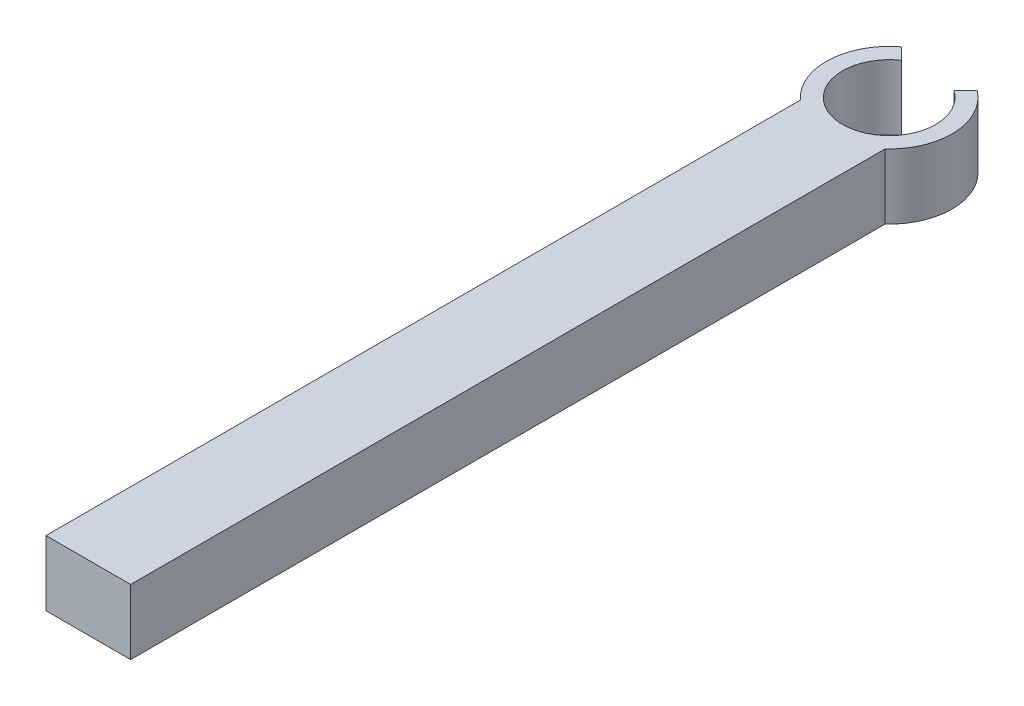
ISO-10303-21;
HEADER;
FILE_DESCRIPTION(('STEP AP214'),'2;1');
FILE_NAME('part.step','',(''),(''),'','','');
FILE_SCHEMA(('AUTOMOTIVE_DESIGN { 1 0 10303 214 1 1 1 1 }'));
ENDSEC;
DATA;
#1=APPLICATION_CONTEXT('core data for automotive mechanical design processes');
#2=APPLICATION_PROTOCOL_DEFINITION('international standard','automotive_design',2000,#1);
#3=PRODUCT_CONTEXT('',#1,'mechanical');
#4=PRODUCT('Part','Part','',(#3));
#5=PRODUCT_RELATED_PRODUCT_CATEGORY('part','',(#4));
#6=PRODUCT_DEFINITION_FORMATION('','',#4);
#7=PRODUCT_DEFINITION_CONTEXT('part definition',#1,'design');
#8=PRODUCT_DEFINITION('design','',#6,#7);
#9=PRODUCT_DEFINITION_SHAPE('','',#8);
#10=(LENGTH_UNIT() NAMED_UNIT(*) SI_UNIT(.MILLI.,.METRE.));
#11=(NAMED_UNIT(*) PLANE_ANGLE_UNIT() SI_UNIT($,.RADIAN.));
#12=(NAMED_UNIT(*) SI_UNIT($,.STERADIAN.) SOLID_ANGLE_UNIT());
#13=UNCERTAINTY_MEASURE_WITH_UNIT(LENGTH_MEASURE(1.E-05),#10,'distance_accuracy_value','');
#14=(GEOMETRIC_REPRESENTATION_CONTEXT(3) GLOBAL_UNCERTAINTY_ASSIGNED_CONTEXT((#13)) GLOBAL_UNIT_ASSIGNED_CONTEXT((#10,
#11,#12)) REPRESENTATION_CONTEXT('',''));
#15=CARTESIAN_POINT('',(0.,0.,0.));
#16=DIRECTION('',(0.,0.,1.));
#17=DIRECTION('',(1.,0.,0.));
#18=AXIS2_PLACEMENT_3D('',#15,#16,#17);
#19=CARTESIAN_POINT('',(-5.29648719383976,10.,-40.6315871682422));
#20=DIRECTION('',(0.,-1.,0.));
#21=DIRECTION('',(0.,0.,-1.));
#22=AXIS2_PLACEMENT_3D('',#19,#20,#21);
#23=CYLINDRICAL_SURFACE('',#22,9.65);
#24=CARTESIAN_POINT('',(-5.29648719383976,10.,-40.6315871682422));
#25=DIRECTION('',(0.,1.,0.));
#26=DIRECTION('',(0.,0.,1.));
#27=AXIS2_PLACEMENT_3D('',#24,#25,#26);
#28=CIRCLE('',#27,9.65);
#29=CARTESIAN_POINT('',(-11.0885304497728,10.,-48.3500543037168));
#30=VERTEX_POINT('',#29);
#31=CARTESIAN_POINT('',(-11.7964871938398,10.,-33.499091111461));
#32=VERTEX_POINT('',#31);
#33=EDGE_CURVE('E115',#30,#32,#28,.T.);
#34=ORIENTED_EDGE('',*,*,#33,.F.);
#35=DIRECTION('',(0.,-1.,0.));
#36=VECTOR('',#35,1.);
#37=CARTESIAN_POINT('',(-11.0885304497728,10.,-48.3500543037168));
#38=LINE('',#37,#36);
#39=CARTESIAN_POINT('',(-11.0885304497728,0.,-48.3500543037168));
#40=VERTEX_POINT('',#39);
#41=EDGE_CURVE('E144',#30,#40,#38,.T.);
#42=ORIENTED_EDGE('',*,*,#41,.T.);
#43=CARTESIAN_POINT('',(-5.29648719383976,0.,-40.6315871682422));
#44=DIRECTION('',(0.,1.,0.));
#45=DIRECTION('',(0.,0.,1.));
#46=AXIS2_PLACEMENT_3D('',#43,#44,#45);
#47=CIRCLE('',#46,9.65);
#48=CARTESIAN_POINT('',(-11.7964871938398,0.,-33.499091111461));
#49=VERTEX_POINT('',#48);
#50=EDGE_CURVE('E143',#40,#49,#47,.T.);
#51=ORIENTED_EDGE('',*,*,#50,.T.);
#52=DIRECTION('',(0.,-1.,0.));
#53=VECTOR('',#52,1.);
#54=CARTESIAN_POINT('',(-11.7964871938398,10.,-33.499091111461));
#55=LINE('',#54,#53);
#56=EDGE_CURVE('E41',#32,#49,#55,.T.);
#57=ORIENTED_EDGE('',*,*,#56,.F.);
#58=EDGE_LOOP('',(#34,#42,#51,#57));
#59=FACE_BOUND('',#58,.T.);
#60=ADVANCED_FACE('F33',(#59),#23,.T.);
#61=CARTESIAN_POINT('',(1.20351280616024,0.,-33.499091111461));
#62=VERTEX_POINT('',#61);
#63=CARTESIAN_POINT('',(0.495556062093275,0.,-48.3500543037168));
#64=VERTEX_POINT('',#63);
#65=EDGE_CURVE('E145',#62,#64,#47,.T.);
#66=ORIENTED_EDGE('',*,*,#65,.T.);
#67=DIRECTION('',(0.,-1.,0.));
#68=VECTOR('',#67,1.);
#69=CARTESIAN_POINT('',(0.495556062093279,10.,-48.3500543037168));
#70=LINE('',#69,#68);
#71=CARTESIAN_POINT('',(0.495556062093277,10.,-48.3500543037168));
#72=VERTEX_POINT('',#71);
#73=EDGE_CURVE('E55',#64,#72,#70,.F.);
#74=ORIENTED_EDGE('',*,*,#73,.T.);
#75=CARTESIAN_POINT('',(1.20351280616024,10.,-33.499091111461));
#76=VERTEX_POINT('',#75);
#77=EDGE_CURVE('E118',#76,#72,#28,.T.);
#78=ORIENTED_EDGE('',*,*,#77,.F.);
#79=DIRECTION('',(0.,-1.,0.));
#80=VECTOR('',#79,1.);
#81=CARTESIAN_POINT('',(1.20351280616024,10.,-33.499091111461));
#82=LINE('',#81,#80);
#83=EDGE_CURVE('E125',#76,#62,#82,.T.);
#84=ORIENTED_EDGE('',*,*,#83,.T.);
#85=EDGE_LOOP('',(#66,#74,#78,#84));
#86=FACE_BOUND('',#85,.T.);
#87=ADVANCED_FACE('F35',(#86),#23,.T.);
#88=CARTESIAN_POINT('',(-11.7964871938398,10.,0.));
#89=DIRECTION('',(1.,0.,0.));
#90=DIRECTION('',(0.,0.,-1.));
#91=AXIS2_PLACEMENT_3D('',#88,#89,#90);
#92=PLANE('',#91);
#93=DIRECTION('',(0.,0.,1.));
#94=VECTOR('',#93,1.);
#95=CARTESIAN_POINT('',(-11.7964871938398,0.,0.));
#96=LINE('',#95,#94);
#97=CARTESIAN_POINT('',(-11.7964871938397,0.,82.3470870334791));
#98=VERTEX_POINT('',#97);
#99=EDGE_CURVE('E138',#49,#98,#96,.T.);
#100=ORIENTED_EDGE('',*,*,#99,.T.);
#101=DIRECTION('',(0.,-1.,0.));
#102=VECTOR('',#101,1.);
#103=CARTESIAN_POINT('',(-11.7964871938397,10.,82.3470870334791));
#104=LINE('',#103,#102);
#105=CARTESIAN_POINT('',(-11.7964871938397,10.,82.3470870334791));
#106=VERTEX_POINT('',#105);
#107=EDGE_CURVE('E129',#106,#98,#104,.T.);
#108=ORIENTED_EDGE('',*,*,#107,.F.);
#109=DIRECTION('',(0.,0.,1.));
#110=VECTOR('',#109,1.);
#111=CARTESIAN_POINT('',(-11.7964871938398,10.,0.));
#112=LINE('',#111,#110);
#113=EDGE_CURVE('E139',#32,#106,#112,.T.);
#114=ORIENTED_EDGE('',*,*,#113,.F.);
#115=ORIENTED_EDGE('',*,*,#56,.T.);
#116=EDGE_LOOP('',(#100,#108,#114,#115));
#117=FACE_BOUND('',#116,.T.);
#118=ADVANCED_FACE('F135',(#117),#92,.F.);
#119=CARTESIAN_POINT('',(0.,10.,82.3470870334791));
#120=DIRECTION('',(0.,0.,-1.));
#121=DIRECTION('',(-1.,0.,0.));
#122=AXIS2_PLACEMENT_3D('',#119,#120,#121);
#123=PLANE('',#122);
#124=DIRECTION('',(1.,0.,0.));
#125=VECTOR('',#124,1.);
#126=CARTESIAN_POINT('',(0.,0.,82.3470870334791));
#127=LINE('',#126,#125);
#128=CARTESIAN_POINT('',(1.20351280616026,0.,82.3470870334791));
#129=VERTEX_POINT('',#128);
#130=EDGE_CURVE('E121',#98,#129,#127,.T.);
#131=ORIENTED_EDGE('',*,*,#130,.T.);
#132=DIRECTION('',(0.,-1.,0.));
#133=VECTOR('',#132,1.);
#134=CARTESIAN_POINT('',(1.20351280616026,10.,82.3470870334791));
#135=LINE('',#134,#133);
#136=CARTESIAN_POINT('',(1.20351280616026,10.,82.3470870334791));
#137=VERTEX_POINT('',#136);
#138=EDGE_CURVE('E127',#137,#129,#135,.T.);
#139=ORIENTED_EDGE('',*,*,#138,.F.);
#140=DIRECTION('',(1.,0.,0.));
#141=VECTOR('',#140,1.);
#142=CARTESIAN_POINT('',(0.,10.,82.3470870334791));
#143=LINE('',#142,#141);
#144=EDGE_CURVE('E155',#106,#137,#143,.T.);
#145=ORIENTED_EDGE('',*,*,#144,.F.);
#146=ORIENTED_EDGE('',*,*,#107,.T.);
#147=EDGE_LOOP('',(#131,#139,#145,#146));
#148=FACE_BOUND('',#147,.T.);
#149=ADVANCED_FACE('F177',(#148),#123,.F.);
#150=CARTESIAN_POINT('',(1.20351280616025,10.,0.));
#151=DIRECTION('',(1.,0.,0.));
#152=DIRECTION('',(0.,0.,-1.));
#153=AXIS2_PLACEMENT_3D('',#150,#151,#152);
#154=PLANE('',#153);
#155=DIRECTION('',(0.,0.,1.));
#156=VECTOR('',#155,1.);
#157=CARTESIAN_POINT('',(1.20351280616025,0.,0.));
#158=LINE('',#157,#156);
#159=EDGE_CURVE('E116',#62,#129,#158,.T.);
#160=ORIENTED_EDGE('',*,*,#159,.F.);
#161=ORIENTED_EDGE('',*,*,#83,.F.);
#162=DIRECTION('',(0.,0.,1.));
#163=VECTOR('',#162,1.);
#164=CARTESIAN_POINT('',(1.20351280616025,10.,0.));
#165=LINE('',#164,#163);
#166=EDGE_CURVE('E152',#76,#137,#165,.T.);
#167=ORIENTED_EDGE('',*,*,#166,.T.);
#168=ORIENTED_EDGE('',*,*,#138,.T.);
#169=EDGE_LOOP('',(#160,#161,#167,#168));
#170=FACE_BOUND('',#169,.T.);
#171=ADVANCED_FACE('F173',(#170),#154,.T.);
#172=CARTESIAN_POINT('',(-5.29648719383976,10.,-40.6315871682422));
#173=DIRECTION('',(0.,-1.,0.));
#174=DIRECTION('',(0.,0.,-1.));
#175=AXIS2_PLACEMENT_3D('',#172,#173,#174);
#176=CYLINDRICAL_SURFACE('',#175,7.15);
#177=DIRECTION('',(0.,1.,0.));
#178=VECTOR('',#177,1.);
#179=CARTESIAN_POINT('',(-9.29648719383976,0.,-46.5580110477838));
#180=LINE('',#179,#178);
#181=CARTESIAN_POINT('',(-9.29648719383975,0.,-46.5580110477838));
#182=VERTEX_POINT('',#181);
#183=CARTESIAN_POINT('',(-9.29648719383976,10.,-46.5580110477838));
#184=VERTEX_POINT('',#183);
#185=EDGE_CURVE('E48',#182,#184,#180,.T.);
#186=ORIENTED_EDGE('',*,*,#185,.T.);
#187=CARTESIAN_POINT('',(-5.29648719383976,10.,-40.6315871682422));
#188=DIRECTION('',(0.,1.,0.));
#189=DIRECTION('',(0.,0.,1.));
#190=AXIS2_PLACEMENT_3D('',#187,#188,#189);
#191=CIRCLE('',#190,7.15);
#192=CARTESIAN_POINT('',(-1.29648719383976,10.,-46.5580110477838));
#193=VERTEX_POINT('',#192);
#194=EDGE_CURVE('E111',#184,#193,#191,.T.);
#195=ORIENTED_EDGE('',*,*,#194,.T.);
#196=DIRECTION('',(0.,1.,0.));
#197=VECTOR('',#196,1.);
#198=CARTESIAN_POINT('',(-1.29648719383976,0.,-46.5580110477838));
#199=LINE('',#198,#197);
#200=CARTESIAN_POINT('',(-1.29648719383976,0.,-46.5580110477838));
#201=VERTEX_POINT('',#200);
#202=EDGE_CURVE('E97',#201,#193,#199,.T.);
#203=ORIENTED_EDGE('',*,*,#202,.F.);
#204=CARTESIAN_POINT('',(-5.29648719383976,0.,-40.6315871682422));
#205=DIRECTION('',(0.,1.,0.));
#206=DIRECTION('',(0.,0.,1.));
#207=AXIS2_PLACEMENT_3D('',#204,#205,#206);
#208=CIRCLE('',#207,7.15);
#209=EDGE_CURVE('E109',#182,#201,#208,.T.);
#210=ORIENTED_EDGE('',*,*,#209,.F.);
#211=EDGE_LOOP('',(#186,#195,#203,#210));
#212=FACE_BOUND('',#211,.T.);
#213=ADVANCED_FACE('F108',(#212),#176,.F.);
#214=CARTESIAN_POINT('',(0.,10.,0.));
#215=DIRECTION('',(0.,1.,0.));
#216=DIRECTION('',(0.,0.,1.));
#217=AXIS2_PLACEMENT_3D('',#214,#215,#216);
#218=PLANE('',#217);
#219=DIRECTION('',(0.707106781186546,0.,0.707106781186549));
#220=VECTOR('',#219,1.);
#221=CARTESIAN_POINT('',(-16.3675550057052,10.,-53.6290788596492));
#222=LINE('',#221,#220);
#223=EDGE_CURVE('E163',#30,#184,#222,.T.);
#224=ORIENTED_EDGE('',*,*,#223,.F.);
#225=ORIENTED_EDGE('',*,*,#33,.T.);
#226=ORIENTED_EDGE('',*,*,#113,.T.);
#227=ORIENTED_EDGE('',*,*,#144,.T.);
#228=ORIENTED_EDGE('',*,*,#166,.F.);
#229=ORIENTED_EDGE('',*,*,#77,.T.);
#230=DIRECTION('',(0.707106781186551,0.,-0.707106781186544));
#231=VECTOR('',#230,1.);
#232=CARTESIAN_POINT('',(5.77458061802576,10.,-53.6290788596492));
#233=LINE('',#232,#231);
#234=EDGE_CURVE('E103',#193,#72,#233,.T.);
#235=ORIENTED_EDGE('',*,*,#234,.F.);
#236=ORIENTED_EDGE('',*,*,#194,.F.);
#237=EDGE_LOOP('',(#224,#225,#226,#227,#228,#229,#235,#236));
#238=FACE_BOUND('',#237,.T.);
#239=ADVANCED_FACE('F167',(#238),#218,.T.);
#240=CARTESIAN_POINT('',(0.,0.,0.));
#241=DIRECTION('',(0.,1.,0.));
#242=DIRECTION('',(0.,0.,1.));
#243=AXIS2_PLACEMENT_3D('',#240,#241,#242);
#244=PLANE('',#243);
#245=ORIENTED_EDGE('',*,*,#50,.F.);
#246=DIRECTION('',(0.707106781186546,0.,0.707106781186549));
#247=VECTOR('',#246,1.);
#248=CARTESIAN_POINT('',(18.630761926972,0.,-18.6307619269719));
#249=LINE('',#248,#247);
#250=EDGE_CURVE('E11',#40,#182,#249,.T.);
#251=ORIENTED_EDGE('',*,*,#250,.T.);
#252=ORIENTED_EDGE('',*,*,#209,.T.);
#253=DIRECTION('',(0.707106781186551,0.,-0.707106781186544));
#254=VECTOR('',#253,1.);
#255=CARTESIAN_POINT('',(5.77458061802576,0.,-53.6290788596492));
#256=LINE('',#255,#254);
#257=EDGE_CURVE('E94',#201,#64,#256,.T.);
#258=ORIENTED_EDGE('',*,*,#257,.T.);
#259=ORIENTED_EDGE('',*,*,#65,.F.);
#260=ORIENTED_EDGE('',*,*,#159,.T.);
#261=ORIENTED_EDGE('',*,*,#130,.F.);
#262=ORIENTED_EDGE('',*,*,#99,.F.);
#263=EDGE_LOOP('',(#245,#251,#252,#258,#259,#260,#261,#262));
#264=FACE_BOUND('',#263,.T.);
#265=ADVANCED_FACE('F114',(#264),#244,.F.);
#266=CARTESIAN_POINT('',(5.77458061802576,0.,-53.6290788596492));
#267=DIRECTION('',(0.707106781186544,0.,0.707106781186551));
#268=DIRECTION('',(0.707106781186551,0.,-0.707106781186544));
#269=AXIS2_PLACEMENT_3D('',#266,#267,#268);
#270=PLANE('',#269);
#271=ORIENTED_EDGE('',*,*,#257,.F.);
#272=ORIENTED_EDGE('',*,*,#202,.T.);
#273=ORIENTED_EDGE('',*,*,#234,.T.);
#274=ORIENTED_EDGE('',*,*,#73,.F.);
#275=EDGE_LOOP('',(#271,#272,#273,#274));
#276=FACE_BOUND('',#275,.T.);
#277=ADVANCED_FACE('F96',(#276),#270,.F.);
#278=CARTESIAN_POINT('',(-16.3675550057052,0.,-53.6290788596492));
#279=DIRECTION('',(-0.707106781186549,0.,0.707106781186546));
#280=DIRECTION('',(0.707106781186546,0.,0.707106781186549));
#281=AXIS2_PLACEMENT_3D('',#278,#279,#280);
#282=PLANE('',#281);
#283=ORIENTED_EDGE('',*,*,#223,.T.);
#284=ORIENTED_EDGE('',*,*,#185,.F.);
#285=ORIENTED_EDGE('',*,*,#250,.F.);
#286=ORIENTED_EDGE('',*,*,#41,.F.);
#287=EDGE_LOOP('',(#283,#284,#285,#286));
#288=FACE_BOUND('',#287,.T.);
#289=ADVANCED_FACE('F165',(#288),#282,.F.);
#290=CLOSED_SHELL('',(#60,#87,#118,#149,#171,#213,#239,#265,#277,#289));
#291=MANIFOLD_SOLID_BREP('B2',#290);
#292=ADVANCED_BREP_SHAPE_REPRESENTATION('',(#18,#291),#14);
#293=SHAPE_DEFINITION_REPRESENTATION(#9,#292);
ENDSEC;
END-ISO-10303-21;
